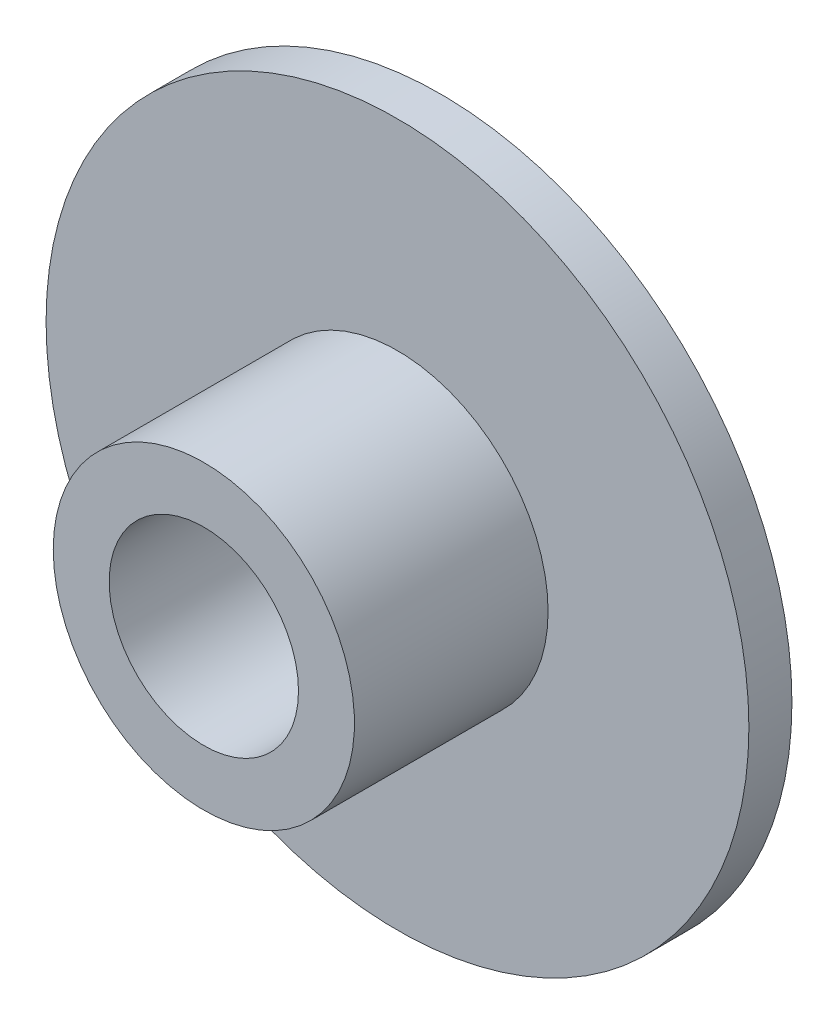
ISO-10303-21;
HEADER;
FILE_DESCRIPTION(('STEP AP214'),'2;1');
FILE_NAME('part.step','',(''),(''),'','','');
FILE_SCHEMA(('AUTOMOTIVE_DESIGN { 1 0 10303 214 1 1 1 1 }'));
ENDSEC;
DATA;
#1=APPLICATION_CONTEXT('core data for automotive mechanical design processes');
#2=APPLICATION_PROTOCOL_DEFINITION('international standard','automotive_design',2000,#1);
#3=PRODUCT_CONTEXT('',#1,'mechanical');
#4=PRODUCT('Part','Part','',(#3));
#5=PRODUCT_RELATED_PRODUCT_CATEGORY('part','',(#4));
#6=PRODUCT_DEFINITION_FORMATION('','',#4);
#7=PRODUCT_DEFINITION_CONTEXT('part definition',#1,'design');
#8=PRODUCT_DEFINITION('design','',#6,#7);
#9=PRODUCT_DEFINITION_SHAPE('','',#8);
#10=(LENGTH_UNIT() NAMED_UNIT(*) SI_UNIT(.MILLI.,.METRE.));
#11=(NAMED_UNIT(*) PLANE_ANGLE_UNIT() SI_UNIT($,.RADIAN.));
#12=(NAMED_UNIT(*) SI_UNIT($,.STERADIAN.) SOLID_ANGLE_UNIT());
#13=UNCERTAINTY_MEASURE_WITH_UNIT(LENGTH_MEASURE(1.E-05),#10,'distance_accuracy_value','');
#14=(GEOMETRIC_REPRESENTATION_CONTEXT(3) GLOBAL_UNCERTAINTY_ASSIGNED_CONTEXT((#13)) GLOBAL_UNIT_ASSIGNED_CONTEXT((#10,
#11,#12)) REPRESENTATION_CONTEXT('',''));
#15=CARTESIAN_POINT('',(0.,0.,0.));
#16=DIRECTION('',(0.,0.,1.));
#17=DIRECTION('',(1.,0.,0.));
#18=AXIS2_PLACEMENT_3D('',#15,#16,#17);
#19=CARTESIAN_POINT('',(-0.0195470693560484,0.0021960919807713,18.7922710574948));
#20=DIRECTION('',(0.,0.,-1.));
#21=DIRECTION('',(-1.,0.,0.));
#22=AXIS2_PLACEMENT_3D('',#19,#20,#21);
#23=PLANE('',#22);
#24=CARTESIAN_POINT('',(-0.0195470693560484,0.0021960919807713,18.7922710574948));
#25=DIRECTION('',(0.,0.,-1.));
#26=DIRECTION('',(-1.,0.,0.));
#27=AXIS2_PLACEMENT_3D('',#24,#25,#26);
#28=CIRCLE('',#27,6.6);
#29=CARTESIAN_POINT('',(-6.61954706935605,0.0021960919807713,18.7922710574948));
#30=VERTEX_POINT('',#29);
#31=EDGE_CURVE('E35',#30,#30,#28,.T.);
#32=ORIENTED_EDGE('',*,*,#31,.F.);
#33=EDGE_LOOP('',(#32));
#34=FACE_BOUND('',#33,.T.);
#35=CARTESIAN_POINT('',(-0.0195470693560484,0.0021960919807713,18.7922710574948));
#36=DIRECTION('',(0.,0.,1.));
#37=DIRECTION('',(1.,0.,0.));
#38=AXIS2_PLACEMENT_3D('',#35,#36,#37);
#39=CIRCLE('',#38,24.5);
#40=CARTESIAN_POINT('',(24.480452930644,0.0021960919807713,18.7922710574948));
#41=VERTEX_POINT('',#40);
#42=EDGE_CURVE('E27',#41,#41,#39,.T.);
#43=ORIENTED_EDGE('',*,*,#42,.F.);
#44=EDGE_LOOP('',(#43));
#45=FACE_BOUND('',#44,.T.);
#46=ADVANCED_FACE('F15',(#34,#45),#23,.T.);
#47=CARTESIAN_POINT('',(-0.0195470693560484,0.0021960919807713,21.7922710574948));
#48=DIRECTION('',(0.,0.,1.));
#49=DIRECTION('',(1.,0.,0.));
#50=AXIS2_PLACEMENT_3D('',#47,#48,#49);
#51=PLANE('',#50);
#52=CARTESIAN_POINT('',(-0.0195470693560484,0.0021960919807713,21.7922710574948));
#53=DIRECTION('',(0.,0.,1.));
#54=DIRECTION('',(1.,0.,0.));
#55=AXIS2_PLACEMENT_3D('',#52,#53,#54);
#56=CIRCLE('',#55,10.5);
#57=CARTESIAN_POINT('',(10.480452930644,0.0021960919807713,21.7922710574948));
#58=VERTEX_POINT('',#57);
#59=EDGE_CURVE('E10',#58,#58,#56,.T.);
#60=ORIENTED_EDGE('',*,*,#59,.F.);
#61=EDGE_LOOP('',(#60));
#62=FACE_BOUND('',#61,.T.);
#63=CARTESIAN_POINT('',(-0.0195470693560484,0.0021960919807713,21.7922710574948));
#64=DIRECTION('',(0.,0.,-1.));
#65=DIRECTION('',(-1.,0.,0.));
#66=AXIS2_PLACEMENT_3D('',#63,#64,#65);
#67=CIRCLE('',#66,24.5);
#68=CARTESIAN_POINT('',(-24.519547069356,0.0021960919807713,21.7922710574948));
#69=VERTEX_POINT('',#68);
#70=EDGE_CURVE('E23',#69,#69,#67,.T.);
#71=ORIENTED_EDGE('',*,*,#70,.F.);
#72=EDGE_LOOP('',(#71));
#73=FACE_BOUND('',#72,.T.);
#74=ADVANCED_FACE('F57',(#62,#73),#51,.T.);
#75=CARTESIAN_POINT('',(-0.0195470693560484,0.0021960919807713,18.7922710574948));
#76=DIRECTION('',(0.,0.,1.));
#77=DIRECTION('',(1.,0.,0.));
#78=AXIS2_PLACEMENT_3D('',#75,#76,#77);
#79=CYLINDRICAL_SURFACE('',#78,24.5);
#80=ORIENTED_EDGE('',*,*,#70,.T.);
#81=EDGE_LOOP('',(#80));
#82=FACE_BOUND('',#81,.T.);
#83=ORIENTED_EDGE('',*,*,#42,.T.);
#84=EDGE_LOOP('',(#83));
#85=FACE_BOUND('',#84,.T.);
#86=ADVANCED_FACE('F17',(#82,#85),#79,.T.);
#87=CARTESIAN_POINT('',(-0.0195470693560484,0.0021960919807713,35.2922710574948));
#88=DIRECTION('',(0.,0.,-1.));
#89=DIRECTION('',(-1.,0.,0.));
#90=AXIS2_PLACEMENT_3D('',#87,#88,#89);
#91=CYLINDRICAL_SURFACE('',#90,10.5);
#92=ORIENTED_EDGE('',*,*,#59,.T.);
#93=EDGE_LOOP('',(#92));
#94=FACE_BOUND('',#93,.T.);
#95=CARTESIAN_POINT('',(-0.0195470693560484,0.0021960919807713,35.2922710574948));
#96=DIRECTION('',(0.,0.,-1.));
#97=DIRECTION('',(-1.,0.,0.));
#98=AXIS2_PLACEMENT_3D('',#95,#96,#97);
#99=CIRCLE('',#98,10.5);
#100=CARTESIAN_POINT('',(-10.519547069356,0.0021960919807713,35.2922710574948));
#101=VERTEX_POINT('',#100);
#102=EDGE_CURVE('E32',#101,#101,#99,.T.);
#103=ORIENTED_EDGE('',*,*,#102,.T.);
#104=EDGE_LOOP('',(#103));
#105=FACE_BOUND('',#104,.T.);
#106=ADVANCED_FACE('F47',(#94,#105),#91,.T.);
#107=CARTESIAN_POINT('',(-0.0195470693560484,0.0021960919807713,35.2922710574948));
#108=DIRECTION('',(0.,0.,1.));
#109=DIRECTION('',(1.,0.,0.));
#110=AXIS2_PLACEMENT_3D('',#107,#108,#109);
#111=PLANE('',#110);
#112=CARTESIAN_POINT('',(-0.0195470693560484,0.0021960919807713,35.2922710574948));
#113=DIRECTION('',(0.,0.,1.));
#114=DIRECTION('',(1.,0.,0.));
#115=AXIS2_PLACEMENT_3D('',#112,#113,#114);
#116=CIRCLE('',#115,6.6);
#117=CARTESIAN_POINT('',(6.58045293064395,0.0021960919807713,35.2922710574948));
#118=VERTEX_POINT('',#117);
#119=EDGE_CURVE('E19',#118,#118,#116,.T.);
#120=ORIENTED_EDGE('',*,*,#119,.F.);
#121=EDGE_LOOP('',(#120));
#122=FACE_BOUND('',#121,.T.);
#123=ORIENTED_EDGE('',*,*,#102,.F.);
#124=EDGE_LOOP('',(#123));
#125=FACE_BOUND('',#124,.T.);
#126=ADVANCED_FACE('F44',(#122,#125),#111,.T.);
#127=CARTESIAN_POINT('',(-0.0195470693560484,0.0021960919807713,16.7922710574948));
#128=DIRECTION('',(0.,0.,1.));
#129=DIRECTION('',(1.,0.,0.));
#130=AXIS2_PLACEMENT_3D('',#127,#128,#129);
#131=CYLINDRICAL_SURFACE('',#130,6.6);
#132=ORIENTED_EDGE('',*,*,#31,.T.);
#133=EDGE_LOOP('',(#132));
#134=FACE_BOUND('',#133,.T.);
#135=ORIENTED_EDGE('',*,*,#119,.T.);
#136=EDGE_LOOP('',(#135));
#137=FACE_BOUND('',#136,.T.);
#138=ADVANCED_FACE('F42',(#134,#137),#131,.F.);
#139=CLOSED_SHELL('',(#46,#74,#86,#106,#126,#138));
#140=MANIFOLD_SOLID_BREP('B1',#139);
#141=ADVANCED_BREP_SHAPE_REPRESENTATION('',(#18,#140),#14);
#142=SHAPE_DEFINITION_REPRESENTATION(#9,#141);
ENDSEC;
END-ISO-10303-21;
